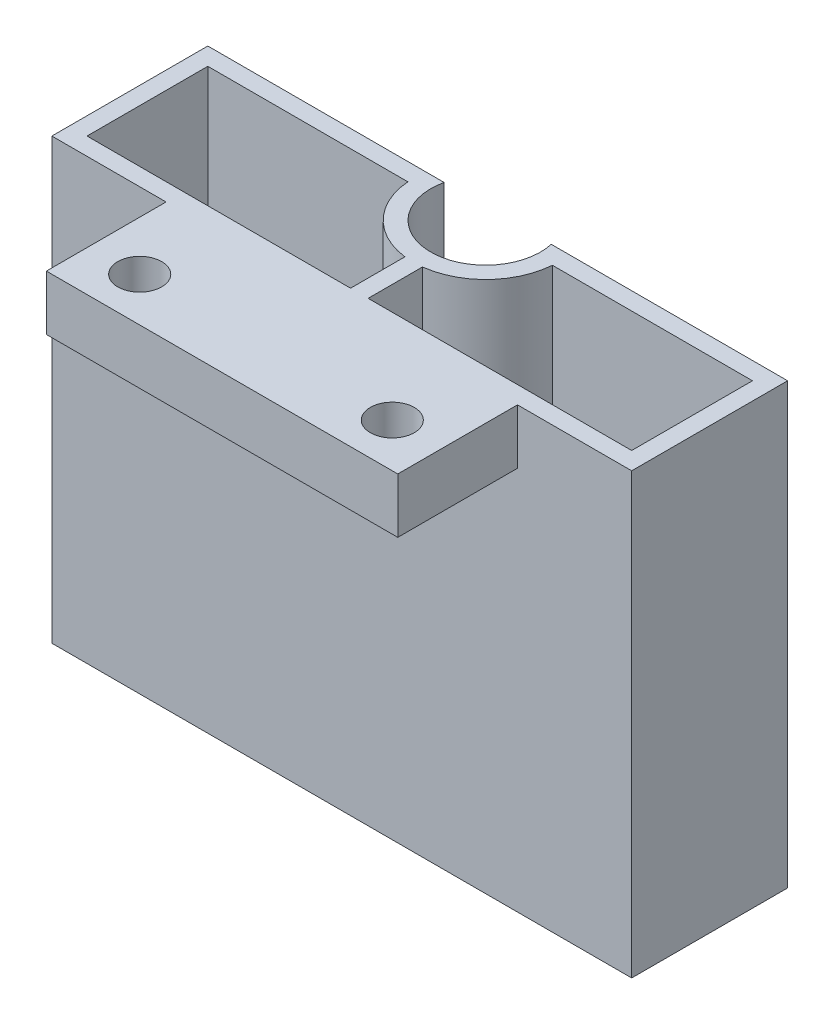
ISO-10303-21;
HEADER;
FILE_DESCRIPTION(('STEP AP214'),'2;1');
FILE_NAME('part.step','',(''),(''),'','','');
FILE_SCHEMA(('AUTOMOTIVE_DESIGN { 1 0 10303 214 1 1 1 1 }'));
ENDSEC;
DATA;
#1=APPLICATION_CONTEXT('core data for automotive mechanical design processes');
#2=APPLICATION_PROTOCOL_DEFINITION('international standard','automotive_design',2000,#1);
#3=PRODUCT_CONTEXT('',#1,'mechanical');
#4=PRODUCT('Part','Part','',(#3));
#5=PRODUCT_RELATED_PRODUCT_CATEGORY('part','',(#4));
#6=PRODUCT_DEFINITION_FORMATION('','',#4);
#7=PRODUCT_DEFINITION_CONTEXT('part definition',#1,'design');
#8=PRODUCT_DEFINITION('design','',#6,#7);
#9=PRODUCT_DEFINITION_SHAPE('','',#8);
#10=(LENGTH_UNIT() NAMED_UNIT(*) SI_UNIT(.MILLI.,.METRE.));
#11=(NAMED_UNIT(*) PLANE_ANGLE_UNIT() SI_UNIT($,.RADIAN.));
#12=(NAMED_UNIT(*) SI_UNIT($,.STERADIAN.) SOLID_ANGLE_UNIT());
#13=UNCERTAINTY_MEASURE_WITH_UNIT(LENGTH_MEASURE(1.E-05),#10,'distance_accuracy_value','');
#14=(GEOMETRIC_REPRESENTATION_CONTEXT(3) GLOBAL_UNCERTAINTY_ASSIGNED_CONTEXT((#13)) GLOBAL_UNIT_ASSIGNED_CONTEXT((#10,
#11,#12)) REPRESENTATION_CONTEXT('',''));
#15=CARTESIAN_POINT('',(0.,0.,0.));
#16=DIRECTION('',(0.,0.,1.));
#17=DIRECTION('',(1.,0.,0.));
#18=AXIS2_PLACEMENT_3D('',#15,#16,#17);
#19=CARTESIAN_POINT('',(0.,0.,0.));
#20=DIRECTION('',(0.,1.,0.));
#21=DIRECTION('',(0.,0.,1.));
#22=AXIS2_PLACEMENT_3D('',#19,#20,#21);
#23=PLANE('',#22);
#24=CARTESIAN_POINT('',(5.75,0.,1.));
#25=DIRECTION('',(0.,1.,0.));
#26=DIRECTION('',(0.,0.,1.));
#27=AXIS2_PLACEMENT_3D('',#24,#25,#26);
#28=CIRCLE('',#27,1.);
#29=CARTESIAN_POINT('',(5.75,0.,2.));
#30=VERTEX_POINT('',#29);
#31=EDGE_CURVE('E122',#30,#30,#28,.T.);
#32=ORIENTED_EDGE('',*,*,#31,.T.);
#33=EDGE_LOOP('',(#32));
#34=FACE_BOUND('',#33,.T.);
#35=CARTESIAN_POINT('',(-5.75,0.,1.));
#36=DIRECTION('',(0.,1.,0.));
#37=DIRECTION('',(0.,0.,1.));
#38=AXIS2_PLACEMENT_3D('',#35,#36,#37);
#39=CIRCLE('',#38,1.);
#40=CARTESIAN_POINT('',(-5.75,0.,2.));
#41=VERTEX_POINT('',#40);
#42=EDGE_CURVE('E105',#41,#41,#39,.T.);
#43=ORIENTED_EDGE('',*,*,#42,.T.);
#44=EDGE_LOOP('',(#43));
#45=FACE_BOUND('',#44,.T.);
#46=DIRECTION('',(-1.,0.,0.));
#47=VECTOR('',#46,1.);
#48=CARTESIAN_POINT('',(0.,0.,-2.45));
#49=LINE('',#48,#47);
#50=CARTESIAN_POINT('',(8.,0.,-2.45));
#51=VERTEX_POINT('',#50);
#52=CARTESIAN_POINT('',(-8.,0.,-2.45));
#53=VERTEX_POINT('',#52);
#54=EDGE_CURVE('E97',#51,#53,#49,.T.);
#55=ORIENTED_EDGE('',*,*,#54,.F.);
#56=DIRECTION('',(0.,0.,-1.));
#57=VECTOR('',#56,1.);
#58=CARTESIAN_POINT('',(8.,0.,-3.));
#59=LINE('',#58,#57);
#60=CARTESIAN_POINT('',(8.,0.,3.));
#61=VERTEX_POINT('',#60);
#62=EDGE_CURVE('E92',#61,#51,#59,.T.);
#63=ORIENTED_EDGE('',*,*,#62,.F.);
#64=DIRECTION('',(1.,0.,0.));
#65=VECTOR('',#64,1.);
#66=CARTESIAN_POINT('',(-8.,0.,3.));
#67=LINE('',#66,#65);
#68=CARTESIAN_POINT('',(-8.,0.,3.));
#69=VERTEX_POINT('',#68);
#70=EDGE_CURVE('E76',#69,#61,#67,.T.);
#71=ORIENTED_EDGE('',*,*,#70,.F.);
#72=DIRECTION('',(0.,0.,1.));
#73=VECTOR('',#72,1.);
#74=CARTESIAN_POINT('',(-8.,0.,-3.));
#75=LINE('',#74,#73);
#76=EDGE_CURVE('E87',#53,#69,#75,.T.);
#77=ORIENTED_EDGE('',*,*,#76,.F.);
#78=EDGE_LOOP('',(#55,#63,#71,#77));
#79=FACE_BOUND('',#78,.T.);
#80=ADVANCED_FACE('F41',(#34,#45,#79),#23,.F.);
#81=CARTESIAN_POINT('',(8.,2.5,-3.));
#82=DIRECTION('',(-1.,0.,0.));
#83=DIRECTION('',(0.,0.,1.));
#84=AXIS2_PLACEMENT_3D('',#81,#82,#83);
#85=PLANE('',#84);
#86=DIRECTION('',(0.,-1.,0.));
#87=VECTOR('',#86,1.);
#88=CARTESIAN_POINT('',(8.,2.5,-2.45));
#89=LINE('',#88,#87);
#90=CARTESIAN_POINT('',(8.,2.5,-2.45));
#91=VERTEX_POINT('',#90);
#92=EDGE_CURVE('E126',#91,#51,#89,.T.);
#93=ORIENTED_EDGE('',*,*,#92,.F.);
#94=DIRECTION('',(0.,0.,-1.));
#95=VECTOR('',#94,1.);
#96=CARTESIAN_POINT('',(8.,2.5,-3.));
#97=LINE('',#96,#95);
#98=CARTESIAN_POINT('',(8.,2.5,3.));
#99=VERTEX_POINT('',#98);
#100=EDGE_CURVE('E86',#99,#91,#97,.T.);
#101=ORIENTED_EDGE('',*,*,#100,.F.);
#102=DIRECTION('',(0.,-1.,0.));
#103=VECTOR('',#102,1.);
#104=CARTESIAN_POINT('',(8.,2.5,3.));
#105=LINE('',#104,#103);
#106=EDGE_CURVE('E79',#99,#61,#105,.T.);
#107=ORIENTED_EDGE('',*,*,#106,.T.);
#108=ORIENTED_EDGE('',*,*,#62,.T.);
#109=EDGE_LOOP('',(#93,#101,#107,#108));
#110=FACE_BOUND('',#109,.T.);
#111=ADVANCED_FACE('F43',(#110),#85,.F.);
#112=CARTESIAN_POINT('',(-8.,2.5,-3.));
#113=DIRECTION('',(1.,0.,0.));
#114=DIRECTION('',(0.,0.,-1.));
#115=AXIS2_PLACEMENT_3D('',#112,#113,#114);
#116=PLANE('',#115);
#117=DIRECTION('',(0.,1.,0.));
#118=VECTOR('',#117,1.);
#119=CARTESIAN_POINT('',(-8.,2.5,-2.45));
#120=LINE('',#119,#118);
#121=CARTESIAN_POINT('',(-8.,2.5,-2.45));
#122=VERTEX_POINT('',#121);
#123=EDGE_CURVE('E11',#53,#122,#120,.T.);
#124=ORIENTED_EDGE('',*,*,#123,.F.);
#125=ORIENTED_EDGE('',*,*,#76,.T.);
#126=DIRECTION('',(0.,-1.,0.));
#127=VECTOR('',#126,1.);
#128=CARTESIAN_POINT('',(-8.,2.5,3.));
#129=LINE('',#128,#127);
#130=CARTESIAN_POINT('',(-8.,2.5,3.));
#131=VERTEX_POINT('',#130);
#132=EDGE_CURVE('E50',#131,#69,#129,.T.);
#133=ORIENTED_EDGE('',*,*,#132,.F.);
#134=DIRECTION('',(0.,0.,1.));
#135=VECTOR('',#134,1.);
#136=CARTESIAN_POINT('',(-8.,2.5,-3.));
#137=LINE('',#136,#135);
#138=EDGE_CURVE('E112',#122,#131,#137,.T.);
#139=ORIENTED_EDGE('',*,*,#138,.F.);
#140=EDGE_LOOP('',(#124,#125,#133,#139));
#141=FACE_BOUND('',#140,.T.);
#142=ADVANCED_FACE('F449',(#141),#116,.F.);
#143=CARTESIAN_POINT('',(0.,2.5,0.));
#144=DIRECTION('',(0.,1.,0.));
#145=DIRECTION('',(0.,0.,1.));
#146=AXIS2_PLACEMENT_3D('',#143,#144,#145);
#147=PLANE('',#146);
#148=DIRECTION('',(-1.,0.,0.));
#149=VECTOR('',#148,1.);
#150=CARTESIAN_POINT('',(0.,2.5,-2.45));
#151=LINE('',#150,#149);
#152=CARTESIAN_POINT('',(-13.2,2.5,-2.45));
#153=VERTEX_POINT('',#152);
#154=EDGE_CURVE('E57',#122,#153,#151,.T.);
#155=ORIENTED_EDGE('',*,*,#154,.F.);
#156=ORIENTED_EDGE('',*,*,#138,.T.);
#157=DIRECTION('',(1.,0.,0.));
#158=VECTOR('',#157,1.);
#159=CARTESIAN_POINT('',(-8.,2.5,3.));
#160=LINE('',#159,#158);
#161=EDGE_CURVE('E63',#131,#99,#160,.T.);
#162=ORIENTED_EDGE('',*,*,#161,.T.);
#163=ORIENTED_EDGE('',*,*,#100,.T.);
#164=CARTESIAN_POINT('',(13.2,2.5,-2.45));
#165=VERTEX_POINT('',#164);
#166=EDGE_CURVE('E260',#165,#91,#151,.T.);
#167=ORIENTED_EDGE('',*,*,#166,.F.);
#168=DIRECTION('',(0.,0.,1.));
#169=VECTOR('',#168,1.);
#170=CARTESIAN_POINT('',(13.2,2.5,0.));
#171=LINE('',#170,#169);
#172=CARTESIAN_POINT('',(13.2,2.5,-9.55000000000001));
#173=VERTEX_POINT('',#172);
#174=EDGE_CURVE('E256',#173,#165,#171,.T.);
#175=ORIENTED_EDGE('',*,*,#174,.F.);
#176=DIRECTION('',(1.,0.,0.));
#177=VECTOR('',#176,1.);
#178=CARTESIAN_POINT('',(0.,2.5,-9.55));
#179=LINE('',#178,#177);
#180=CARTESIAN_POINT('',(2.43874967965144,2.5,-9.55));
#181=VERTEX_POINT('',#180);
#182=EDGE_CURVE('E252',#181,#173,#179,.T.);
#183=ORIENTED_EDGE('',*,*,#182,.F.);
#184=CARTESIAN_POINT('',(0.,2.5,-9.));
#185=DIRECTION('',(0.,1.,0.));
#186=DIRECTION('',(0.,0.,1.));
#187=AXIS2_PLACEMENT_3D('',#184,#185,#186);
#188=CIRCLE('',#187,2.5);
#189=CARTESIAN_POINT('',(-2.43874967965144,2.5,-9.55));
#190=VERTEX_POINT('',#189);
#191=EDGE_CURVE('E248',#190,#181,#188,.T.);
#192=ORIENTED_EDGE('',*,*,#191,.F.);
#193=DIRECTION('',(1.,0.,0.));
#194=VECTOR('',#193,1.);
#195=CARTESIAN_POINT('',(0.,2.5,-9.55));
#196=LINE('',#195,#194);
#197=CARTESIAN_POINT('',(-13.2,2.5,-9.55000000000001));
#198=VERTEX_POINT('',#197);
#199=EDGE_CURVE('E244',#198,#190,#196,.T.);
#200=ORIENTED_EDGE('',*,*,#199,.F.);
#201=DIRECTION('',(0.,0.,1.));
#202=VECTOR('',#201,1.);
#203=CARTESIAN_POINT('',(-13.2,2.5,0.));
#204=LINE('',#203,#202);
#205=EDGE_CURVE('E241',#198,#153,#204,.T.);
#206=ORIENTED_EDGE('',*,*,#205,.T.);
#207=EDGE_LOOP('',(#155,#156,#162,#163,#167,#175,#183,#192,#200,#206));
#208=FACE_BOUND('',#207,.T.);
#209=DIRECTION('',(0.,0.,-1.));
#210=VECTOR('',#209,1.);
#211=CARTESIAN_POINT('',(0.4,2.5,0.));
#212=LINE('',#211,#210);
#213=CARTESIAN_POINT('',(0.4,2.5,-3.25));
#214=VERTEX_POINT('',#213);
#215=CARTESIAN_POINT('',(0.4,2.5,-5.72433212916816));
#216=VERTEX_POINT('',#215);
#217=EDGE_CURVE('E217',#214,#216,#212,.T.);
#218=ORIENTED_EDGE('',*,*,#217,.T.);
#219=CARTESIAN_POINT('',(0.,2.5,-9.));
#220=DIRECTION('',(0.,1.,0.));
#221=DIRECTION('',(0.,0.,1.));
#222=AXIS2_PLACEMENT_3D('',#219,#220,#221);
#223=CIRCLE('',#222,3.3);
#224=CARTESIAN_POINT('',(3.29051667675458,2.5,-8.75));
#225=VERTEX_POINT('',#224);
#226=EDGE_CURVE('E213',#216,#225,#223,.T.);
#227=ORIENTED_EDGE('',*,*,#226,.T.);
#228=DIRECTION('',(1.,0.,0.));
#229=VECTOR('',#228,1.);
#230=CARTESIAN_POINT('',(0.,2.5,-8.75));
#231=LINE('',#230,#229);
#232=CARTESIAN_POINT('',(12.4,2.5,-8.75));
#233=VERTEX_POINT('',#232);
#234=EDGE_CURVE('E209',#225,#233,#231,.T.);
#235=ORIENTED_EDGE('',*,*,#234,.T.);
#236=DIRECTION('',(0.,0.,1.));
#237=VECTOR('',#236,1.);
#238=CARTESIAN_POINT('',(12.4,2.5,0.));
#239=LINE('',#238,#237);
#240=CARTESIAN_POINT('',(12.4,2.5,-3.25));
#241=VERTEX_POINT('',#240);
#242=EDGE_CURVE('E205',#233,#241,#239,.T.);
#243=ORIENTED_EDGE('',*,*,#242,.T.);
#244=DIRECTION('',(1.,0.,0.));
#245=VECTOR('',#244,1.);
#246=CARTESIAN_POINT('',(0.,2.5,-3.25));
#247=LINE('',#246,#245);
#248=EDGE_CURVE('E200',#214,#241,#247,.T.);
#249=ORIENTED_EDGE('',*,*,#248,.F.);
#250=EDGE_LOOP('',(#218,#227,#235,#243,#249));
#251=FACE_BOUND('',#250,.T.);
#252=DIRECTION('',(1.,0.,0.));
#253=VECTOR('',#252,1.);
#254=CARTESIAN_POINT('',(0.,2.5,-8.75));
#255=LINE('',#254,#253);
#256=CARTESIAN_POINT('',(-12.4,2.5,-8.75));
#257=VERTEX_POINT('',#256);
#258=CARTESIAN_POINT('',(-3.29051667675458,2.5,-8.75));
#259=VERTEX_POINT('',#258);
#260=EDGE_CURVE('E237',#257,#259,#255,.T.);
#261=ORIENTED_EDGE('',*,*,#260,.T.);
#262=CARTESIAN_POINT('',(0.,2.5,-9.));
#263=DIRECTION('',(0.,1.,0.));
#264=DIRECTION('',(0.,0.,1.));
#265=AXIS2_PLACEMENT_3D('',#262,#263,#264);
#266=CIRCLE('',#265,3.3);
#267=CARTESIAN_POINT('',(-0.4,2.5,-5.72433212916816));
#268=VERTEX_POINT('',#267);
#269=EDGE_CURVE('E233',#259,#268,#266,.T.);
#270=ORIENTED_EDGE('',*,*,#269,.T.);
#271=DIRECTION('',(0.,0.,-1.));
#272=VECTOR('',#271,1.);
#273=CARTESIAN_POINT('',(-0.4,2.5,0.));
#274=LINE('',#273,#272);
#275=CARTESIAN_POINT('',(-0.4,2.5,-3.25));
#276=VERTEX_POINT('',#275);
#277=EDGE_CURVE('E229',#276,#268,#274,.T.);
#278=ORIENTED_EDGE('',*,*,#277,.F.);
#279=DIRECTION('',(-1.,0.,0.));
#280=VECTOR('',#279,1.);
#281=CARTESIAN_POINT('',(0.,2.5,-3.25));
#282=LINE('',#281,#280);
#283=CARTESIAN_POINT('',(-12.4,2.5,-3.25));
#284=VERTEX_POINT('',#283);
#285=EDGE_CURVE('E225',#276,#284,#282,.T.);
#286=ORIENTED_EDGE('',*,*,#285,.T.);
#287=DIRECTION('',(0.,0.,1.));
#288=VECTOR('',#287,1.);
#289=CARTESIAN_POINT('',(-12.4,2.5,0.));
#290=LINE('',#289,#288);
#291=EDGE_CURVE('E221',#257,#284,#290,.T.);
#292=ORIENTED_EDGE('',*,*,#291,.F.);
#293=EDGE_LOOP('',(#261,#270,#278,#286,#292));
#294=FACE_BOUND('',#293,.T.);
#295=CARTESIAN_POINT('',(-5.75,2.5,1.));
#296=DIRECTION('',(0.,1.,0.));
#297=DIRECTION('',(0.,0.,1.));
#298=AXIS2_PLACEMENT_3D('',#295,#296,#297);
#299=CIRCLE('',#298,1.);
#300=CARTESIAN_POINT('',(-5.75,2.5,2.));
#301=VERTEX_POINT('',#300);
#302=EDGE_CURVE('E99',#301,#301,#299,.T.);
#303=ORIENTED_EDGE('',*,*,#302,.F.);
#304=EDGE_LOOP('',(#303));
#305=FACE_BOUND('',#304,.T.);
#306=CARTESIAN_POINT('',(5.75,2.5,1.));
#307=DIRECTION('',(0.,1.,0.));
#308=DIRECTION('',(0.,0.,1.));
#309=AXIS2_PLACEMENT_3D('',#306,#307,#308);
#310=CIRCLE('',#309,1.);
#311=CARTESIAN_POINT('',(5.75,2.5,2.));
#312=VERTEX_POINT('',#311);
#313=EDGE_CURVE('E120',#312,#312,#310,.T.);
#314=ORIENTED_EDGE('',*,*,#313,.F.);
#315=EDGE_LOOP('',(#314));
#316=FACE_BOUND('',#315,.T.);
#317=ADVANCED_FACE('F421',(#208,#251,#294,#305,#316),#147,.T.);
#318=CARTESIAN_POINT('',(-8.,2.5,3.));
#319=DIRECTION('',(0.,0.,-1.));
#320=DIRECTION('',(-1.,0.,0.));
#321=AXIS2_PLACEMENT_3D('',#318,#319,#320);
#322=PLANE('',#321);
#323=ORIENTED_EDGE('',*,*,#70,.T.);
#324=ORIENTED_EDGE('',*,*,#106,.F.);
#325=ORIENTED_EDGE('',*,*,#161,.F.);
#326=ORIENTED_EDGE('',*,*,#132,.T.);
#327=EDGE_LOOP('',(#323,#324,#325,#326));
#328=FACE_BOUND('',#327,.T.);
#329=ADVANCED_FACE('F78',(#328),#322,.F.);
#330=CARTESIAN_POINT('',(-5.75,2.5,1.));
#331=DIRECTION('',(0.,-1.,0.));
#332=DIRECTION('',(0.,0.,-1.));
#333=AXIS2_PLACEMENT_3D('',#330,#331,#332);
#334=CYLINDRICAL_SURFACE('',#333,1.);
#335=ORIENTED_EDGE('',*,*,#302,.T.);
#336=EDGE_LOOP('',(#335));
#337=FACE_BOUND('',#336,.T.);
#338=ORIENTED_EDGE('',*,*,#42,.F.);
#339=EDGE_LOOP('',(#338));
#340=FACE_BOUND('',#339,.T.);
#341=ADVANCED_FACE('F455',(#337,#340),#334,.F.);
#342=CARTESIAN_POINT('',(5.75,2.5,1.));
#343=DIRECTION('',(0.,-1.,0.));
#344=DIRECTION('',(0.,0.,-1.));
#345=AXIS2_PLACEMENT_3D('',#342,#343,#344);
#346=CYLINDRICAL_SURFACE('',#345,1.);
#347=ORIENTED_EDGE('',*,*,#313,.T.);
#348=EDGE_LOOP('',(#347));
#349=FACE_BOUND('',#348,.T.);
#350=ORIENTED_EDGE('',*,*,#31,.F.);
#351=EDGE_LOOP('',(#350));
#352=FACE_BOUND('',#351,.T.);
#353=ADVANCED_FACE('F475',(#349,#352),#346,.F.);
#354=CARTESIAN_POINT('',(0.,-17.5,-2.45));
#355=DIRECTION('',(0.,0.,-1.));
#356=DIRECTION('',(-1.,0.,0.));
#357=AXIS2_PLACEMENT_3D('',#354,#355,#356);
#358=PLANE('',#357);
#359=ORIENTED_EDGE('',*,*,#166,.T.);
#360=ORIENTED_EDGE('',*,*,#92,.T.);
#361=ORIENTED_EDGE('',*,*,#54,.T.);
#362=ORIENTED_EDGE('',*,*,#123,.T.);
#363=ORIENTED_EDGE('',*,*,#154,.T.);
#364=DIRECTION('',(0.,1.,0.));
#365=VECTOR('',#364,1.);
#366=CARTESIAN_POINT('',(-13.2,-17.5,-2.45));
#367=LINE('',#366,#365);
#368=CARTESIAN_POINT('',(-13.2,-17.5,-2.45));
#369=VERTEX_POINT('',#368);
#370=EDGE_CURVE('E157',#369,#153,#367,.T.);
#371=ORIENTED_EDGE('',*,*,#370,.F.);
#372=DIRECTION('',(-1.,0.,0.));
#373=VECTOR('',#372,1.);
#374=CARTESIAN_POINT('',(0.,-17.5,-2.45));
#375=LINE('',#374,#373);
#376=CARTESIAN_POINT('',(13.2,-17.5,-2.45));
#377=VERTEX_POINT('',#376);
#378=EDGE_CURVE('E204',#377,#369,#375,.T.);
#379=ORIENTED_EDGE('',*,*,#378,.F.);
#380=DIRECTION('',(0.,1.,0.));
#381=VECTOR('',#380,1.);
#382=CARTESIAN_POINT('',(13.2,-17.5,-2.45));
#383=LINE('',#382,#381);
#384=EDGE_CURVE('E136',#377,#165,#383,.T.);
#385=ORIENTED_EDGE('',*,*,#384,.T.);
#386=EDGE_LOOP('',(#359,#360,#361,#362,#363,#371,#379,#385));
#387=FACE_BOUND('',#386,.T.);
#388=ADVANCED_FACE('F339',(#387),#358,.F.);
#389=CARTESIAN_POINT('',(0.4,-17.5,0.));
#390=DIRECTION('',(1.,0.,0.));
#391=DIRECTION('',(0.,0.,-1.));
#392=AXIS2_PLACEMENT_3D('',#389,#390,#391);
#393=PLANE('',#392);
#394=ORIENTED_EDGE('',*,*,#217,.F.);
#395=DIRECTION('',(0.,1.,0.));
#396=VECTOR('',#395,1.);
#397=CARTESIAN_POINT('',(0.4,-17.5,-3.25));
#398=LINE('',#397,#396);
#399=CARTESIAN_POINT('',(0.4,-17.5,-3.25));
#400=VERTEX_POINT('',#399);
#401=EDGE_CURVE('E135',#400,#214,#398,.T.);
#402=ORIENTED_EDGE('',*,*,#401,.F.);
#403=DIRECTION('',(0.,0.,-1.));
#404=VECTOR('',#403,1.);
#405=CARTESIAN_POINT('',(0.4,-17.5,0.));
#406=LINE('',#405,#404);
#407=CARTESIAN_POINT('',(0.4,-17.5,-5.72433212916816));
#408=VERTEX_POINT('',#407);
#409=EDGE_CURVE('E279',#400,#408,#406,.T.);
#410=ORIENTED_EDGE('',*,*,#409,.T.);
#411=DIRECTION('',(0.,1.,0.));
#412=VECTOR('',#411,1.);
#413=CARTESIAN_POINT('',(0.4,-17.5,-5.72433212916816));
#414=LINE('',#413,#412);
#415=EDGE_CURVE('E181',#408,#216,#414,.T.);
#416=ORIENTED_EDGE('',*,*,#415,.T.);
#417=EDGE_LOOP('',(#394,#402,#410,#416));
#418=FACE_BOUND('',#417,.T.);
#419=ADVANCED_FACE('F488',(#418),#393,.T.);
#420=CARTESIAN_POINT('',(0.,-17.5,-3.25));
#421=DIRECTION('',(0.,0.,1.));
#422=DIRECTION('',(1.,0.,0.));
#423=AXIS2_PLACEMENT_3D('',#420,#421,#422);
#424=PLANE('',#423);
#425=ORIENTED_EDGE('',*,*,#248,.T.);
#426=DIRECTION('',(0.,1.,0.));
#427=VECTOR('',#426,1.);
#428=CARTESIAN_POINT('',(12.4,-17.5,-3.25));
#429=LINE('',#428,#427);
#430=CARTESIAN_POINT('',(12.4,-17.5,-3.25));
#431=VERTEX_POINT('',#430);
#432=EDGE_CURVE('E193',#431,#241,#429,.T.);
#433=ORIENTED_EDGE('',*,*,#432,.F.);
#434=DIRECTION('',(1.,0.,0.));
#435=VECTOR('',#434,1.);
#436=CARTESIAN_POINT('',(0.,-17.5,-3.25));
#437=LINE('',#436,#435);
#438=EDGE_CURVE('E141',#400,#431,#437,.T.);
#439=ORIENTED_EDGE('',*,*,#438,.F.);
#440=ORIENTED_EDGE('',*,*,#401,.T.);
#441=EDGE_LOOP('',(#425,#433,#439,#440));
#442=FACE_BOUND('',#441,.T.);
#443=ADVANCED_FACE('F495',(#442),#424,.F.);
#444=CARTESIAN_POINT('',(12.4,-17.5,0.));
#445=DIRECTION('',(-1.,0.,0.));
#446=DIRECTION('',(0.,0.,1.));
#447=AXIS2_PLACEMENT_3D('',#444,#445,#446);
#448=PLANE('',#447);
#449=ORIENTED_EDGE('',*,*,#242,.F.);
#450=DIRECTION('',(0.,1.,0.));
#451=VECTOR('',#450,1.);
#452=CARTESIAN_POINT('',(12.4,-17.5,-8.75));
#453=LINE('',#452,#451);
#454=CARTESIAN_POINT('',(12.4,-17.5,-8.75));
#455=VERTEX_POINT('',#454);
#456=EDGE_CURVE('E189',#455,#233,#453,.T.);
#457=ORIENTED_EDGE('',*,*,#456,.F.);
#458=DIRECTION('',(0.,0.,1.));
#459=VECTOR('',#458,1.);
#460=CARTESIAN_POINT('',(12.4,-17.5,0.));
#461=LINE('',#460,#459);
#462=EDGE_CURVE('E267',#455,#431,#461,.T.);
#463=ORIENTED_EDGE('',*,*,#462,.T.);
#464=ORIENTED_EDGE('',*,*,#432,.T.);
#465=EDGE_LOOP('',(#449,#457,#463,#464));
#466=FACE_BOUND('',#465,.T.);
#467=ADVANCED_FACE('F503',(#466),#448,.T.);
#468=CARTESIAN_POINT('',(0.,-17.5,-8.75));
#469=DIRECTION('',(0.,0.,1.));
#470=DIRECTION('',(1.,0.,0.));
#471=AXIS2_PLACEMENT_3D('',#468,#469,#470);
#472=PLANE('',#471);
#473=ORIENTED_EDGE('',*,*,#234,.F.);
#474=DIRECTION('',(0.,1.,0.));
#475=VECTOR('',#474,1.);
#476=CARTESIAN_POINT('',(3.29051667675458,-17.5,-8.75));
#477=LINE('',#476,#475);
#478=CARTESIAN_POINT('',(3.29051667675458,-17.5,-8.75));
#479=VERTEX_POINT('',#478);
#480=EDGE_CURVE('E185',#479,#225,#477,.T.);
#481=ORIENTED_EDGE('',*,*,#480,.F.);
#482=DIRECTION('',(1.,0.,0.));
#483=VECTOR('',#482,1.);
#484=CARTESIAN_POINT('',(0.,-17.5,-8.75));
#485=LINE('',#484,#483);
#486=EDGE_CURVE('E271',#479,#455,#485,.T.);
#487=ORIENTED_EDGE('',*,*,#486,.T.);
#488=ORIENTED_EDGE('',*,*,#456,.T.);
#489=EDGE_LOOP('',(#473,#481,#487,#488));
#490=FACE_BOUND('',#489,.T.);
#491=ADVANCED_FACE('F511',(#490),#472,.T.);
#492=CARTESIAN_POINT('',(0.,-17.5,-8.75));
#493=DIRECTION('',(0.,0.,1.));
#494=DIRECTION('',(1.,0.,0.));
#495=AXIS2_PLACEMENT_3D('',#492,#493,#494);
#496=PLANE('',#495);
#497=ORIENTED_EDGE('',*,*,#260,.F.);
#498=DIRECTION('',(0.,1.,0.));
#499=VECTOR('',#498,1.);
#500=CARTESIAN_POINT('',(-12.4,-17.5,-8.75));
#501=LINE('',#500,#499);
#502=CARTESIAN_POINT('',(-12.4,-17.5,-8.75));
#503=VERTEX_POINT('',#502);
#504=EDGE_CURVE('E177',#503,#257,#501,.T.);
#505=ORIENTED_EDGE('',*,*,#504,.F.);
#506=DIRECTION('',(1.,0.,0.));
#507=VECTOR('',#506,1.);
#508=CARTESIAN_POINT('',(0.,-17.5,-8.75));
#509=LINE('',#508,#507);
#510=CARTESIAN_POINT('',(-3.29051667675458,-17.5,-8.75));
#511=VERTEX_POINT('',#510);
#512=EDGE_CURVE('E299',#503,#511,#509,.T.);
#513=ORIENTED_EDGE('',*,*,#512,.T.);
#514=DIRECTION('',(0.,1.,0.));
#515=VECTOR('',#514,1.);
#516=CARTESIAN_POINT('',(-3.29051667675458,-17.5,-8.75));
#517=LINE('',#516,#515);
#518=EDGE_CURVE('E161',#511,#259,#517,.T.);
#519=ORIENTED_EDGE('',*,*,#518,.T.);
#520=EDGE_LOOP('',(#497,#505,#513,#519));
#521=FACE_BOUND('',#520,.T.);
#522=ADVANCED_FACE('F519',(#521),#496,.T.);
#523=CARTESIAN_POINT('',(-12.4,-17.5,0.));
#524=DIRECTION('',(-1.,0.,0.));
#525=DIRECTION('',(0.,0.,1.));
#526=AXIS2_PLACEMENT_3D('',#523,#524,#525);
#527=PLANE('',#526);
#528=ORIENTED_EDGE('',*,*,#291,.T.);
#529=DIRECTION('',(0.,1.,0.));
#530=VECTOR('',#529,1.);
#531=CARTESIAN_POINT('',(-12.4,-17.5,-3.25));
#532=LINE('',#531,#530);
#533=CARTESIAN_POINT('',(-12.4,-17.5,-3.25));
#534=VERTEX_POINT('',#533);
#535=EDGE_CURVE('E173',#534,#284,#532,.T.);
#536=ORIENTED_EDGE('',*,*,#535,.F.);
#537=DIRECTION('',(0.,0.,1.));
#538=VECTOR('',#537,1.);
#539=CARTESIAN_POINT('',(-12.4,-17.5,0.));
#540=LINE('',#539,#538);
#541=EDGE_CURVE('E283',#503,#534,#540,.T.);
#542=ORIENTED_EDGE('',*,*,#541,.F.);
#543=ORIENTED_EDGE('',*,*,#504,.T.);
#544=EDGE_LOOP('',(#528,#536,#542,#543));
#545=FACE_BOUND('',#544,.T.);
#546=ADVANCED_FACE('F527',(#545),#527,.F.);
#547=CARTESIAN_POINT('',(0.,-17.5,-3.25));
#548=DIRECTION('',(0.,0.,-1.));
#549=DIRECTION('',(-1.,0.,0.));
#550=AXIS2_PLACEMENT_3D('',#547,#548,#549);
#551=PLANE('',#550);
#552=ORIENTED_EDGE('',*,*,#285,.F.);
#553=DIRECTION('',(0.,1.,0.));
#554=VECTOR('',#553,1.);
#555=CARTESIAN_POINT('',(-0.4,-17.5,-3.25));
#556=LINE('',#555,#554);
#557=CARTESIAN_POINT('',(-0.4,-17.5,-3.25));
#558=VERTEX_POINT('',#557);
#559=EDGE_CURVE('E169',#558,#276,#556,.T.);
#560=ORIENTED_EDGE('',*,*,#559,.F.);
#561=DIRECTION('',(-1.,0.,0.));
#562=VECTOR('',#561,1.);
#563=CARTESIAN_POINT('',(0.,-17.5,-3.25));
#564=LINE('',#563,#562);
#565=EDGE_CURVE('E287',#558,#534,#564,.T.);
#566=ORIENTED_EDGE('',*,*,#565,.T.);
#567=ORIENTED_EDGE('',*,*,#535,.T.);
#568=EDGE_LOOP('',(#552,#560,#566,#567));
#569=FACE_BOUND('',#568,.T.);
#570=ADVANCED_FACE('F535',(#569),#551,.T.);
#571=CARTESIAN_POINT('',(-0.4,-17.5,0.));
#572=DIRECTION('',(1.,0.,0.));
#573=DIRECTION('',(0.,0.,-1.));
#574=AXIS2_PLACEMENT_3D('',#571,#572,#573);
#575=PLANE('',#574);
#576=ORIENTED_EDGE('',*,*,#277,.T.);
#577=DIRECTION('',(0.,1.,0.));
#578=VECTOR('',#577,1.);
#579=CARTESIAN_POINT('',(-0.4,-17.5,-5.72433212916816));
#580=LINE('',#579,#578);
#581=CARTESIAN_POINT('',(-0.4,-17.5,-5.72433212916816));
#582=VERTEX_POINT('',#581);
#583=EDGE_CURVE('E165',#582,#268,#580,.T.);
#584=ORIENTED_EDGE('',*,*,#583,.F.);
#585=DIRECTION('',(0.,0.,-1.));
#586=VECTOR('',#585,1.);
#587=CARTESIAN_POINT('',(-0.4,-17.5,0.));
#588=LINE('',#587,#586);
#589=EDGE_CURVE('E291',#558,#582,#588,.T.);
#590=ORIENTED_EDGE('',*,*,#589,.F.);
#591=ORIENTED_EDGE('',*,*,#559,.T.);
#592=EDGE_LOOP('',(#576,#584,#590,#591));
#593=FACE_BOUND('',#592,.T.);
#594=ADVANCED_FACE('F543',(#593),#575,.F.);
#595=CARTESIAN_POINT('',(-13.2,-17.5,0.));
#596=DIRECTION('',(-1.,0.,0.));
#597=DIRECTION('',(0.,0.,1.));
#598=AXIS2_PLACEMENT_3D('',#595,#596,#597);
#599=PLANE('',#598);
#600=ORIENTED_EDGE('',*,*,#205,.F.);
#601=DIRECTION('',(0.,1.,0.));
#602=VECTOR('',#601,1.);
#603=CARTESIAN_POINT('',(-13.2,-17.5,-9.55000000000001));
#604=LINE('',#603,#602);
#605=CARTESIAN_POINT('',(-13.2,-17.5,-9.55000000000001));
#606=VERTEX_POINT('',#605);
#607=EDGE_CURVE('E153',#606,#198,#604,.T.);
#608=ORIENTED_EDGE('',*,*,#607,.F.);
#609=DIRECTION('',(0.,0.,1.));
#610=VECTOR('',#609,1.);
#611=CARTESIAN_POINT('',(-13.2,-17.5,0.));
#612=LINE('',#611,#610);
#613=EDGE_CURVE('E303',#606,#369,#612,.T.);
#614=ORIENTED_EDGE('',*,*,#613,.T.);
#615=ORIENTED_EDGE('',*,*,#370,.T.);
#616=EDGE_LOOP('',(#600,#608,#614,#615));
#617=FACE_BOUND('',#616,.T.);
#618=ADVANCED_FACE('F344',(#617),#599,.T.);
#619=CARTESIAN_POINT('',(0.,-17.5,-9.55));
#620=DIRECTION('',(0.,0.,1.));
#621=DIRECTION('',(1.,0.,0.));
#622=AXIS2_PLACEMENT_3D('',#619,#620,#621);
#623=PLANE('',#622);
#624=ORIENTED_EDGE('',*,*,#199,.T.);
#625=DIRECTION('',(0.,1.,0.));
#626=VECTOR('',#625,1.);
#627=CARTESIAN_POINT('',(-2.43874967965144,-17.5,-9.55));
#628=LINE('',#627,#626);
#629=CARTESIAN_POINT('',(-2.43874967965144,-17.5,-9.55));
#630=VERTEX_POINT('',#629);
#631=EDGE_CURVE('E149',#630,#190,#628,.T.);
#632=ORIENTED_EDGE('',*,*,#631,.F.);
#633=DIRECTION('',(1.,0.,0.));
#634=VECTOR('',#633,1.);
#635=CARTESIAN_POINT('',(0.,-17.5,-9.55));
#636=LINE('',#635,#634);
#637=EDGE_CURVE('E307',#606,#630,#636,.T.);
#638=ORIENTED_EDGE('',*,*,#637,.F.);
#639=ORIENTED_EDGE('',*,*,#607,.T.);
#640=EDGE_LOOP('',(#624,#632,#638,#639));
#641=FACE_BOUND('',#640,.T.);
#642=ADVANCED_FACE('F352',(#641),#623,.F.);
#643=CARTESIAN_POINT('',(0.,-17.5,-9.));
#644=DIRECTION('',(0.,1.,0.));
#645=DIRECTION('',(0.,0.,1.));
#646=AXIS2_PLACEMENT_3D('',#643,#644,#645);
#647=CYLINDRICAL_SURFACE('',#646,2.5);
#648=ORIENTED_EDGE('',*,*,#191,.T.);
#649=DIRECTION('',(0.,1.,0.));
#650=VECTOR('',#649,1.);
#651=CARTESIAN_POINT('',(2.43874967965144,-17.5,-9.55));
#652=LINE('',#651,#650);
#653=CARTESIAN_POINT('',(2.43874967965144,-17.5,-9.55));
#654=VERTEX_POINT('',#653);
#655=EDGE_CURVE('E145',#654,#181,#652,.T.);
#656=ORIENTED_EDGE('',*,*,#655,.F.);
#657=CARTESIAN_POINT('',(0.,-17.5,-9.));
#658=DIRECTION('',(0.,1.,0.));
#659=DIRECTION('',(0.,0.,1.));
#660=AXIS2_PLACEMENT_3D('',#657,#658,#659);
#661=CIRCLE('',#660,2.5);
#662=EDGE_CURVE('E311',#630,#654,#661,.T.);
#663=ORIENTED_EDGE('',*,*,#662,.F.);
#664=ORIENTED_EDGE('',*,*,#631,.T.);
#665=EDGE_LOOP('',(#648,#656,#663,#664));
#666=FACE_BOUND('',#665,.T.);
#667=ADVANCED_FACE('F433',(#666),#647,.F.);
#668=CARTESIAN_POINT('',(0.,-17.5,-9.55));
#669=DIRECTION('',(0.,0.,1.));
#670=DIRECTION('',(1.,0.,0.));
#671=AXIS2_PLACEMENT_3D('',#668,#669,#670);
#672=PLANE('',#671);
#673=ORIENTED_EDGE('',*,*,#182,.T.);
#674=DIRECTION('',(0.,1.,0.));
#675=VECTOR('',#674,1.);
#676=CARTESIAN_POINT('',(13.2,-17.5,-9.55000000000001));
#677=LINE('',#676,#675);
#678=CARTESIAN_POINT('',(13.2,-17.5,-9.55000000000001));
#679=VERTEX_POINT('',#678);
#680=EDGE_CURVE('E140',#679,#173,#677,.T.);
#681=ORIENTED_EDGE('',*,*,#680,.F.);
#682=DIRECTION('',(1.,0.,0.));
#683=VECTOR('',#682,1.);
#684=CARTESIAN_POINT('',(0.,-17.5,-9.55));
#685=LINE('',#684,#683);
#686=EDGE_CURVE('E315',#654,#679,#685,.T.);
#687=ORIENTED_EDGE('',*,*,#686,.F.);
#688=ORIENTED_EDGE('',*,*,#655,.T.);
#689=EDGE_LOOP('',(#673,#681,#687,#688));
#690=FACE_BOUND('',#689,.T.);
#691=ADVANCED_FACE('F430',(#690),#672,.F.);
#692=CARTESIAN_POINT('',(0.,-17.5,-9.));
#693=DIRECTION('',(0.,1.,0.));
#694=DIRECTION('',(0.,0.,1.));
#695=AXIS2_PLACEMENT_3D('',#692,#693,#694);
#696=CYLINDRICAL_SURFACE('',#695,3.3);
#697=ORIENTED_EDGE('',*,*,#269,.F.);
#698=ORIENTED_EDGE('',*,*,#518,.F.);
#699=CARTESIAN_POINT('',(0.,-17.5,-9.));
#700=DIRECTION('',(0.,1.,0.));
#701=DIRECTION('',(0.,0.,1.));
#702=AXIS2_PLACEMENT_3D('',#699,#700,#701);
#703=CIRCLE('',#702,3.3);
#704=EDGE_CURVE('E295',#511,#582,#703,.T.);
#705=ORIENTED_EDGE('',*,*,#704,.T.);
#706=ORIENTED_EDGE('',*,*,#583,.T.);
#707=EDGE_LOOP('',(#697,#698,#705,#706));
#708=FACE_BOUND('',#707,.T.);
#709=ADVANCED_FACE('F440',(#708),#696,.T.);
#710=CARTESIAN_POINT('',(13.2,-17.5,0.));
#711=DIRECTION('',(-1.,0.,0.));
#712=DIRECTION('',(0.,0.,1.));
#713=AXIS2_PLACEMENT_3D('',#710,#711,#712);
#714=PLANE('',#713);
#715=ORIENTED_EDGE('',*,*,#174,.T.);
#716=ORIENTED_EDGE('',*,*,#384,.F.);
#717=DIRECTION('',(0.,0.,1.));
#718=VECTOR('',#717,1.);
#719=CARTESIAN_POINT('',(13.2,-17.5,0.));
#720=LINE('',#719,#718);
#721=EDGE_CURVE('E319',#679,#377,#720,.T.);
#722=ORIENTED_EDGE('',*,*,#721,.F.);
#723=ORIENTED_EDGE('',*,*,#680,.T.);
#724=EDGE_LOOP('',(#715,#716,#722,#723));
#725=FACE_BOUND('',#724,.T.);
#726=ADVANCED_FACE('F426',(#725),#714,.F.);
#727=CARTESIAN_POINT('',(0.,-17.5,-9.));
#728=DIRECTION('',(0.,1.,0.));
#729=DIRECTION('',(0.,0.,1.));
#730=AXIS2_PLACEMENT_3D('',#727,#728,#729);
#731=CYLINDRICAL_SURFACE('',#730,3.3);
#732=ORIENTED_EDGE('',*,*,#226,.F.);
#733=ORIENTED_EDGE('',*,*,#415,.F.);
#734=CARTESIAN_POINT('',(0.,-17.5,-9.));
#735=DIRECTION('',(0.,1.,0.));
#736=DIRECTION('',(0.,0.,1.));
#737=AXIS2_PLACEMENT_3D('',#734,#735,#736);
#738=CIRCLE('',#737,3.3);
#739=EDGE_CURVE('E275',#408,#479,#738,.T.);
#740=ORIENTED_EDGE('',*,*,#739,.T.);
#741=ORIENTED_EDGE('',*,*,#480,.T.);
#742=EDGE_LOOP('',(#732,#733,#740,#741));
#743=FACE_BOUND('',#742,.T.);
#744=ADVANCED_FACE('F590',(#743),#731,.T.);
#745=CARTESIAN_POINT('',(0.,-17.5,0.));
#746=DIRECTION('',(0.,1.,0.));
#747=DIRECTION('',(0.,0.,1.));
#748=AXIS2_PLACEMENT_3D('',#745,#746,#747);
#749=PLANE('',#748);
#750=ORIENTED_EDGE('',*,*,#378,.T.);
#751=ORIENTED_EDGE('',*,*,#613,.F.);
#752=ORIENTED_EDGE('',*,*,#637,.T.);
#753=ORIENTED_EDGE('',*,*,#662,.T.);
#754=ORIENTED_EDGE('',*,*,#686,.T.);
#755=ORIENTED_EDGE('',*,*,#721,.T.);
#756=EDGE_LOOP('',(#750,#751,#752,#753,#754,#755));
#757=FACE_BOUND('',#756,.T.);
#758=ORIENTED_EDGE('',*,*,#512,.F.);
#759=ORIENTED_EDGE('',*,*,#541,.T.);
#760=ORIENTED_EDGE('',*,*,#565,.F.);
#761=ORIENTED_EDGE('',*,*,#589,.T.);
#762=ORIENTED_EDGE('',*,*,#704,.F.);
#763=EDGE_LOOP('',(#758,#759,#760,#761,#762));
#764=FACE_BOUND('',#763,.T.);
#765=ORIENTED_EDGE('',*,*,#409,.F.);
#766=ORIENTED_EDGE('',*,*,#438,.T.);
#767=ORIENTED_EDGE('',*,*,#462,.F.);
#768=ORIENTED_EDGE('',*,*,#486,.F.);
#769=ORIENTED_EDGE('',*,*,#739,.F.);
#770=EDGE_LOOP('',(#765,#766,#767,#768,#769));
#771=FACE_BOUND('',#770,.T.);
#772=ADVANCED_FACE('F330',(#757,#764,#771),#749,.F.);
#773=CLOSED_SHELL('',(#80,#111,#142,#317,#329,#341,#353,#388,#419,#443,#467,#491,#522,#546,#570,
#594,#618,#642,#667,#691,#709,#726,#744,#772));
#774=MANIFOLD_SOLID_BREP('B2',#773);
#775=ADVANCED_BREP_SHAPE_REPRESENTATION('',(#18,#774),#14);
#776=SHAPE_DEFINITION_REPRESENTATION(#9,#775);
ENDSEC;
END-ISO-10303-21;
